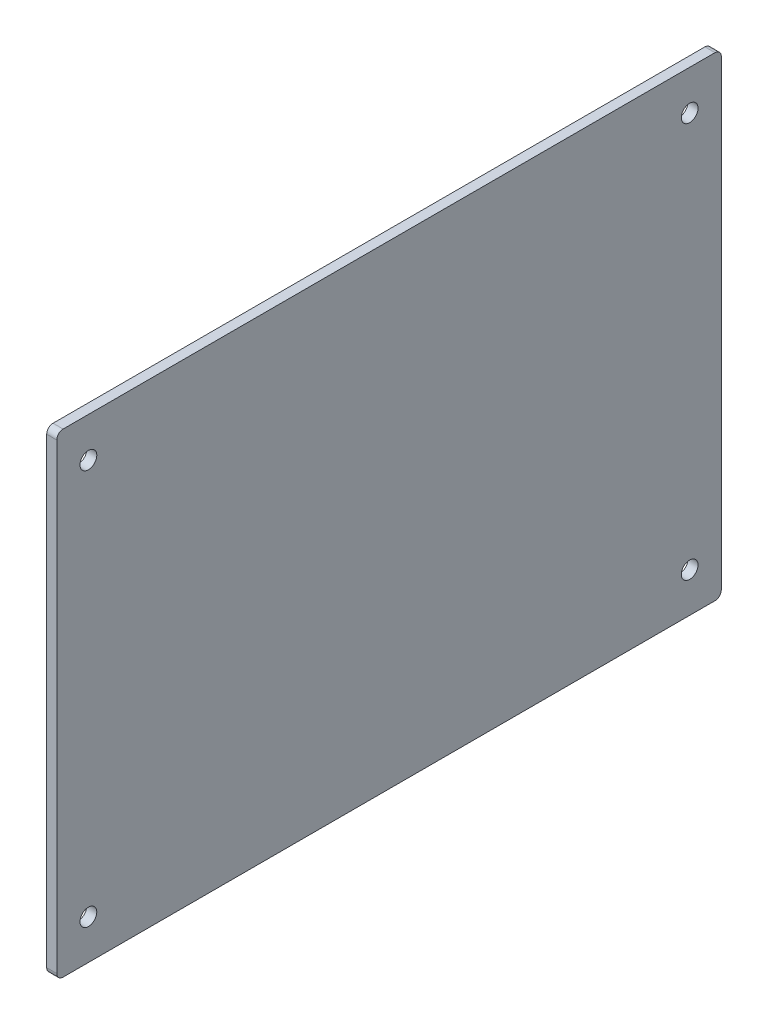
ISO-10303-21;
HEADER;
FILE_DESCRIPTION(('STEP AP214'),'2;1');
FILE_NAME('part.step','',(''),(''),'','','');
FILE_SCHEMA(('AUTOMOTIVE_DESIGN { 1 0 10303 214 1 1 1 1 }'));
ENDSEC;
DATA;
#1=APPLICATION_CONTEXT('core data for automotive mechanical design processes');
#2=APPLICATION_PROTOCOL_DEFINITION('international standard','automotive_design',2000,#1);
#3=PRODUCT_CONTEXT('',#1,'mechanical');
#4=PRODUCT('Part','Part','',(#3));
#5=PRODUCT_RELATED_PRODUCT_CATEGORY('part','',(#4));
#6=PRODUCT_DEFINITION_FORMATION('','',#4);
#7=PRODUCT_DEFINITION_CONTEXT('part definition',#1,'design');
#8=PRODUCT_DEFINITION('design','',#6,#7);
#9=PRODUCT_DEFINITION_SHAPE('','',#8);
#10=(LENGTH_UNIT() NAMED_UNIT(*) SI_UNIT(.MILLI.,.METRE.));
#11=(NAMED_UNIT(*) PLANE_ANGLE_UNIT() SI_UNIT($,.RADIAN.));
#12=(NAMED_UNIT(*) SI_UNIT($,.STERADIAN.) SOLID_ANGLE_UNIT());
#13=UNCERTAINTY_MEASURE_WITH_UNIT(LENGTH_MEASURE(1.E-05),#10,'distance_accuracy_value','');
#14=(GEOMETRIC_REPRESENTATION_CONTEXT(3) GLOBAL_UNCERTAINTY_ASSIGNED_CONTEXT((#13)) GLOBAL_UNIT_ASSIGNED_CONTEXT((#10,
#11,#12)) REPRESENTATION_CONTEXT('',''));
#15=CARTESIAN_POINT('',(0.,0.,0.));
#16=DIRECTION('',(0.,0.,1.));
#17=DIRECTION('',(1.,0.,0.));
#18=AXIS2_PLACEMENT_3D('',#15,#16,#17);
#19=CARTESIAN_POINT('',(0.,0.,0.));
#20=DIRECTION('',(-1.,0.,0.));
#21=DIRECTION('',(0.,0.,1.));
#22=AXIS2_PLACEMENT_3D('',#19,#20,#21);
#23=PLANE('',#22);
#24=DIRECTION('',(0.,1.,0.));
#25=VECTOR('',#24,1.);
#26=CARTESIAN_POINT('',(0.,-75.,-105.));
#27=LINE('',#26,#25);
#28=CARTESIAN_POINT('',(0.,-73.,-105.));
#29=VERTEX_POINT('',#28);
#30=CARTESIAN_POINT('',(0.,73.,-105.));
#31=VERTEX_POINT('',#30);
#32=EDGE_CURVE('E123',#29,#31,#27,.T.);
#33=ORIENTED_EDGE('',*,*,#32,.F.);
#34=CARTESIAN_POINT('',(0.,-73.,-103.));
#35=DIRECTION('',(-1.,0.,0.));
#36=DIRECTION('',(0.,0.,1.));
#37=AXIS2_PLACEMENT_3D('',#34,#35,#36);
#38=CIRCLE('',#37,2.);
#39=CARTESIAN_POINT('',(0.,-75.,-103.));
#40=VERTEX_POINT('',#39);
#41=EDGE_CURVE('E106',#29,#40,#38,.T.);
#42=ORIENTED_EDGE('',*,*,#41,.T.);
#43=DIRECTION('',(0.,0.,-1.));
#44=VECTOR('',#43,1.);
#45=CARTESIAN_POINT('',(0.,-75.,105.));
#46=LINE('',#45,#44);
#47=CARTESIAN_POINT('',(0.,-75.,103.));
#48=VERTEX_POINT('',#47);
#49=EDGE_CURVE('E147',#48,#40,#46,.T.);
#50=ORIENTED_EDGE('',*,*,#49,.F.);
#51=CARTESIAN_POINT('',(0.,-73.,103.));
#52=DIRECTION('',(-1.,0.,0.));
#53=DIRECTION('',(0.,0.,1.));
#54=AXIS2_PLACEMENT_3D('',#51,#52,#53);
#55=CIRCLE('',#54,2.);
#56=CARTESIAN_POINT('',(0.,-73.,105.));
#57=VERTEX_POINT('',#56);
#58=EDGE_CURVE('E117',#48,#57,#55,.T.);
#59=ORIENTED_EDGE('',*,*,#58,.T.);
#60=DIRECTION('',(0.,-1.,0.));
#61=VECTOR('',#60,1.);
#62=CARTESIAN_POINT('',(0.,-75.,105.));
#63=LINE('',#62,#61);
#64=CARTESIAN_POINT('',(0.,73.,105.));
#65=VERTEX_POINT('',#64);
#66=EDGE_CURVE('E137',#65,#57,#63,.T.);
#67=ORIENTED_EDGE('',*,*,#66,.F.);
#68=CARTESIAN_POINT('',(0.,73.,103.));
#69=DIRECTION('',(-1.,0.,0.));
#70=DIRECTION('',(0.,0.,1.));
#71=AXIS2_PLACEMENT_3D('',#68,#69,#70);
#72=CIRCLE('',#71,2.);
#73=CARTESIAN_POINT('',(0.,75.,103.));
#74=VERTEX_POINT('',#73);
#75=EDGE_CURVE('E127',#65,#74,#72,.T.);
#76=ORIENTED_EDGE('',*,*,#75,.T.);
#77=DIRECTION('',(0.,0.,1.));
#78=VECTOR('',#77,1.);
#79=CARTESIAN_POINT('',(0.,75.,105.));
#80=LINE('',#79,#78);
#81=CARTESIAN_POINT('',(0.,75.,-103.));
#82=VERTEX_POINT('',#81);
#83=EDGE_CURVE('E133',#82,#74,#80,.T.);
#84=ORIENTED_EDGE('',*,*,#83,.F.);
#85=CARTESIAN_POINT('',(0.,73.,-103.));
#86=DIRECTION('',(-1.,0.,0.));
#87=DIRECTION('',(0.,0.,1.));
#88=AXIS2_PLACEMENT_3D('',#85,#86,#87);
#89=CIRCLE('',#88,2.);
#90=EDGE_CURVE('E132',#82,#31,#89,.T.);
#91=ORIENTED_EDGE('',*,*,#90,.T.);
#92=EDGE_LOOP('',(#33,#42,#50,#59,#67,#76,#84,#91));
#93=FACE_BOUND('',#92,.T.);
#94=CARTESIAN_POINT('',(0.,-62.5,-95.));
#95=DIRECTION('',(1.,0.,0.));
#96=DIRECTION('',(0.,0.,-1.));
#97=AXIS2_PLACEMENT_3D('',#94,#95,#96);
#98=CIRCLE('',#97,2.65);
#99=CARTESIAN_POINT('',(0.,-62.5,-97.65));
#100=VERTEX_POINT('',#99);
#101=EDGE_CURVE('E134',#100,#100,#98,.T.);
#102=ORIENTED_EDGE('',*,*,#101,.T.);
#103=EDGE_LOOP('',(#102));
#104=FACE_BOUND('',#103,.T.);
#105=CARTESIAN_POINT('',(0.,-62.5,95.));
#106=DIRECTION('',(1.,0.,0.));
#107=DIRECTION('',(0.,0.,-1.));
#108=AXIS2_PLACEMENT_3D('',#105,#106,#107);
#109=CIRCLE('',#108,2.65);
#110=CARTESIAN_POINT('',(0.,-62.5,92.35));
#111=VERTEX_POINT('',#110);
#112=EDGE_CURVE('E192',#111,#111,#109,.T.);
#113=ORIENTED_EDGE('',*,*,#112,.T.);
#114=EDGE_LOOP('',(#113));
#115=FACE_BOUND('',#114,.T.);
#116=CARTESIAN_POINT('',(0.,62.5,-95.));
#117=DIRECTION('',(1.,0.,0.));
#118=DIRECTION('',(0.,0.,-1.));
#119=AXIS2_PLACEMENT_3D('',#116,#117,#118);
#120=CIRCLE('',#119,2.65);
#121=CARTESIAN_POINT('',(0.,62.5,-97.65));
#122=VERTEX_POINT('',#121);
#123=EDGE_CURVE('E198',#122,#122,#120,.T.);
#124=ORIENTED_EDGE('',*,*,#123,.T.);
#125=EDGE_LOOP('',(#124));
#126=FACE_BOUND('',#125,.T.);
#127=CARTESIAN_POINT('',(0.,62.5,95.));
#128=DIRECTION('',(1.,0.,0.));
#129=DIRECTION('',(0.,0.,-1.));
#130=AXIS2_PLACEMENT_3D('',#127,#128,#129);
#131=CIRCLE('',#130,2.65);
#132=CARTESIAN_POINT('',(0.,62.5,92.35));
#133=VERTEX_POINT('',#132);
#134=EDGE_CURVE('E204',#133,#133,#131,.T.);
#135=ORIENTED_EDGE('',*,*,#134,.T.);
#136=EDGE_LOOP('',(#135));
#137=FACE_BOUND('',#136,.T.);
#138=ADVANCED_FACE('F39',(#93,#104,#115,#126,#137),#23,.T.);
#139=CARTESIAN_POINT('',(3.175,-75.,-105.));
#140=DIRECTION('',(0.,0.,1.));
#141=DIRECTION('',(1.,0.,0.));
#142=AXIS2_PLACEMENT_3D('',#139,#140,#141);
#143=PLANE('',#142);
#144=DIRECTION('',(0.,1.,0.));
#145=VECTOR('',#144,1.);
#146=CARTESIAN_POINT('',(3.175,-75.,-105.));
#147=LINE('',#146,#145);
#148=CARTESIAN_POINT('',(3.175,-73.,-105.));
#149=VERTEX_POINT('',#148);
#150=CARTESIAN_POINT('',(3.175,73.,-105.));
#151=VERTEX_POINT('',#150);
#152=EDGE_CURVE('E126',#149,#151,#147,.T.);
#153=ORIENTED_EDGE('',*,*,#152,.F.);
#154=DIRECTION('',(-1.,0.,0.));
#155=VECTOR('',#154,1.);
#156=CARTESIAN_POINT('',(3.175,-73.,-105.));
#157=LINE('',#156,#155);
#158=EDGE_CURVE('E110',#149,#29,#157,.T.);
#159=ORIENTED_EDGE('',*,*,#158,.T.);
#160=ORIENTED_EDGE('',*,*,#32,.T.);
#161=DIRECTION('',(-1.,0.,0.));
#162=VECTOR('',#161,1.);
#163=CARTESIAN_POINT('',(3.175,73.,-105.));
#164=LINE('',#163,#162);
#165=EDGE_CURVE('E128',#31,#151,#164,.F.);
#166=ORIENTED_EDGE('',*,*,#165,.T.);
#167=EDGE_LOOP('',(#153,#159,#160,#166));
#168=FACE_BOUND('',#167,.T.);
#169=ADVANCED_FACE('F122',(#168),#143,.F.);
#170=CARTESIAN_POINT('',(3.175,75.,105.));
#171=DIRECTION('',(0.,-1.,0.));
#172=DIRECTION('',(0.,0.,-1.));
#173=AXIS2_PLACEMENT_3D('',#170,#171,#172);
#174=PLANE('',#173);
#175=DIRECTION('',(0.,0.,1.));
#176=VECTOR('',#175,1.);
#177=CARTESIAN_POINT('',(3.175,75.,105.));
#178=LINE('',#177,#176);
#179=CARTESIAN_POINT('',(3.175,75.,-103.));
#180=VERTEX_POINT('',#179);
#181=CARTESIAN_POINT('',(3.175,75.,103.));
#182=VERTEX_POINT('',#181);
#183=EDGE_CURVE('E170',#180,#182,#178,.T.);
#184=ORIENTED_EDGE('',*,*,#183,.F.);
#185=DIRECTION('',(-1.,0.,0.));
#186=VECTOR('',#185,1.);
#187=CARTESIAN_POINT('',(3.175,75.,-103.));
#188=LINE('',#187,#186);
#189=EDGE_CURVE('E11',#180,#82,#188,.T.);
#190=ORIENTED_EDGE('',*,*,#189,.T.);
#191=ORIENTED_EDGE('',*,*,#83,.T.);
#192=DIRECTION('',(-1.,0.,0.));
#193=VECTOR('',#192,1.);
#194=CARTESIAN_POINT('',(3.175,75.,103.));
#195=LINE('',#194,#193);
#196=EDGE_CURVE('E47',#74,#182,#195,.F.);
#197=ORIENTED_EDGE('',*,*,#196,.T.);
#198=EDGE_LOOP('',(#184,#190,#191,#197));
#199=FACE_BOUND('',#198,.T.);
#200=ADVANCED_FACE('F169',(#199),#174,.F.);
#201=CARTESIAN_POINT('',(3.175,-75.,105.));
#202=DIRECTION('',(0.,0.,-1.));
#203=DIRECTION('',(-1.,0.,0.));
#204=AXIS2_PLACEMENT_3D('',#201,#202,#203);
#205=PLANE('',#204);
#206=ORIENTED_EDGE('',*,*,#66,.T.);
#207=DIRECTION('',(-1.,0.,0.));
#208=VECTOR('',#207,1.);
#209=CARTESIAN_POINT('',(3.175,-73.,105.));
#210=LINE('',#209,#208);
#211=CARTESIAN_POINT('',(3.175,-73.,105.));
#212=VERTEX_POINT('',#211);
#213=EDGE_CURVE('E54',#57,#212,#210,.F.);
#214=ORIENTED_EDGE('',*,*,#213,.T.);
#215=DIRECTION('',(0.,-1.,0.));
#216=VECTOR('',#215,1.);
#217=CARTESIAN_POINT('',(3.175,-75.,105.));
#218=LINE('',#217,#216);
#219=CARTESIAN_POINT('',(3.175,73.,105.));
#220=VERTEX_POINT('',#219);
#221=EDGE_CURVE('E176',#220,#212,#218,.T.);
#222=ORIENTED_EDGE('',*,*,#221,.F.);
#223=DIRECTION('',(-1.,0.,0.));
#224=VECTOR('',#223,1.);
#225=CARTESIAN_POINT('',(3.175,73.,105.));
#226=LINE('',#225,#224);
#227=EDGE_CURVE('E163',#220,#65,#226,.T.);
#228=ORIENTED_EDGE('',*,*,#227,.T.);
#229=EDGE_LOOP('',(#206,#214,#222,#228));
#230=FACE_BOUND('',#229,.T.);
#231=ADVANCED_FACE('F180',(#230),#205,.F.);
#232=CARTESIAN_POINT('',(3.175,-75.,105.));
#233=DIRECTION('',(0.,1.,0.));
#234=DIRECTION('',(0.,0.,1.));
#235=AXIS2_PLACEMENT_3D('',#232,#233,#234);
#236=PLANE('',#235);
#237=ORIENTED_EDGE('',*,*,#49,.T.);
#238=DIRECTION('',(-1.,0.,0.));
#239=VECTOR('',#238,1.);
#240=CARTESIAN_POINT('',(3.175,-75.,-103.));
#241=LINE('',#240,#239);
#242=CARTESIAN_POINT('',(3.175,-75.,-103.));
#243=VERTEX_POINT('',#242);
#244=EDGE_CURVE('E111',#40,#243,#241,.F.);
#245=ORIENTED_EDGE('',*,*,#244,.T.);
#246=DIRECTION('',(0.,0.,-1.));
#247=VECTOR('',#246,1.);
#248=CARTESIAN_POINT('',(3.175,-75.,105.));
#249=LINE('',#248,#247);
#250=CARTESIAN_POINT('',(3.175,-75.,103.));
#251=VERTEX_POINT('',#250);
#252=EDGE_CURVE('E143',#251,#243,#249,.T.);
#253=ORIENTED_EDGE('',*,*,#252,.F.);
#254=DIRECTION('',(-1.,0.,0.));
#255=VECTOR('',#254,1.);
#256=CARTESIAN_POINT('',(3.175,-75.,103.));
#257=LINE('',#256,#255);
#258=EDGE_CURVE('E116',#251,#48,#257,.T.);
#259=ORIENTED_EDGE('',*,*,#258,.T.);
#260=EDGE_LOOP('',(#237,#245,#253,#259));
#261=FACE_BOUND('',#260,.T.);
#262=ADVANCED_FACE('F187',(#261),#236,.F.);
#263=CARTESIAN_POINT('',(3.175,0.,0.));
#264=DIRECTION('',(-1.,0.,0.));
#265=DIRECTION('',(0.,0.,1.));
#266=AXIS2_PLACEMENT_3D('',#263,#264,#265);
#267=PLANE('',#266);
#268=CARTESIAN_POINT('',(3.175,62.5,95.));
#269=DIRECTION('',(1.,0.,0.));
#270=DIRECTION('',(0.,0.,-1.));
#271=AXIS2_PLACEMENT_3D('',#268,#269,#270);
#272=CIRCLE('',#271,2.64999999999999);
#273=CARTESIAN_POINT('',(3.175,62.5,92.35));
#274=VERTEX_POINT('',#273);
#275=EDGE_CURVE('E207',#274,#274,#272,.T.);
#276=ORIENTED_EDGE('',*,*,#275,.F.);
#277=EDGE_LOOP('',(#276));
#278=FACE_BOUND('',#277,.T.);
#279=CARTESIAN_POINT('',(3.175,62.5,-95.));
#280=DIRECTION('',(1.,0.,0.));
#281=DIRECTION('',(0.,0.,-1.));
#282=AXIS2_PLACEMENT_3D('',#279,#280,#281);
#283=CIRCLE('',#282,2.64999999999999);
#284=CARTESIAN_POINT('',(3.175,62.5,-97.65));
#285=VERTEX_POINT('',#284);
#286=EDGE_CURVE('E201',#285,#285,#283,.T.);
#287=ORIENTED_EDGE('',*,*,#286,.F.);
#288=EDGE_LOOP('',(#287));
#289=FACE_BOUND('',#288,.T.);
#290=CARTESIAN_POINT('',(3.175,-62.5,95.));
#291=DIRECTION('',(1.,0.,0.));
#292=DIRECTION('',(0.,0.,-1.));
#293=AXIS2_PLACEMENT_3D('',#290,#291,#292);
#294=CIRCLE('',#293,2.64999999999999);
#295=CARTESIAN_POINT('',(3.175,-62.5,92.35));
#296=VERTEX_POINT('',#295);
#297=EDGE_CURVE('E195',#296,#296,#294,.T.);
#298=ORIENTED_EDGE('',*,*,#297,.F.);
#299=EDGE_LOOP('',(#298));
#300=FACE_BOUND('',#299,.T.);
#301=CARTESIAN_POINT('',(3.175,-62.5,-95.));
#302=DIRECTION('',(1.,0.,0.));
#303=DIRECTION('',(0.,0.,-1.));
#304=AXIS2_PLACEMENT_3D('',#301,#302,#303);
#305=CIRCLE('',#304,2.64999999999999);
#306=CARTESIAN_POINT('',(3.175,-62.5,-97.65));
#307=VERTEX_POINT('',#306);
#308=EDGE_CURVE('E140',#307,#307,#305,.T.);
#309=ORIENTED_EDGE('',*,*,#308,.F.);
#310=EDGE_LOOP('',(#309));
#311=FACE_BOUND('',#310,.T.);
#312=ORIENTED_EDGE('',*,*,#252,.T.);
#313=CARTESIAN_POINT('',(3.175,-73.,-103.));
#314=DIRECTION('',(-1.,0.,0.));
#315=DIRECTION('',(0.,0.,1.));
#316=AXIS2_PLACEMENT_3D('',#313,#314,#315);
#317=CIRCLE('',#316,2.);
#318=EDGE_CURVE('E161',#243,#149,#317,.F.);
#319=ORIENTED_EDGE('',*,*,#318,.T.);
#320=ORIENTED_EDGE('',*,*,#152,.T.);
#321=CARTESIAN_POINT('',(3.175,73.,-103.));
#322=DIRECTION('',(-1.,0.,0.));
#323=DIRECTION('',(0.,0.,1.));
#324=AXIS2_PLACEMENT_3D('',#321,#322,#323);
#325=CIRCLE('',#324,2.);
#326=EDGE_CURVE('E157',#151,#180,#325,.F.);
#327=ORIENTED_EDGE('',*,*,#326,.T.);
#328=ORIENTED_EDGE('',*,*,#183,.T.);
#329=CARTESIAN_POINT('',(3.175,73.,103.));
#330=DIRECTION('',(-1.,0.,0.));
#331=DIRECTION('',(0.,0.,1.));
#332=AXIS2_PLACEMENT_3D('',#329,#330,#331);
#333=CIRCLE('',#332,2.);
#334=EDGE_CURVE('E61',#182,#220,#333,.F.);
#335=ORIENTED_EDGE('',*,*,#334,.T.);
#336=ORIENTED_EDGE('',*,*,#221,.T.);
#337=CARTESIAN_POINT('',(3.175,-73.,103.));
#338=DIRECTION('',(-1.,0.,0.));
#339=DIRECTION('',(0.,0.,1.));
#340=AXIS2_PLACEMENT_3D('',#337,#338,#339);
#341=CIRCLE('',#340,2.);
#342=EDGE_CURVE('E159',#212,#251,#341,.F.);
#343=ORIENTED_EDGE('',*,*,#342,.T.);
#344=EDGE_LOOP('',(#312,#319,#320,#327,#328,#335,#336,#343));
#345=FACE_BOUND('',#344,.T.);
#346=ADVANCED_FACE('F174',(#278,#289,#300,#311,#345),#267,.F.);
#347=CARTESIAN_POINT('',(3.175,-62.5,-95.));
#348=DIRECTION('',(1.,0.,0.));
#349=DIRECTION('',(0.,0.,-1.));
#350=AXIS2_PLACEMENT_3D('',#347,#348,#349);
#351=CYLINDRICAL_SURFACE('',#350,2.64999999999999);
#352=ORIENTED_EDGE('',*,*,#101,.F.);
#353=EDGE_LOOP('',(#352));
#354=FACE_BOUND('',#353,.T.);
#355=ORIENTED_EDGE('',*,*,#308,.T.);
#356=EDGE_LOOP('',(#355));
#357=FACE_BOUND('',#356,.T.);
#358=ADVANCED_FACE('F215',(#354,#357),#351,.F.);
#359=CARTESIAN_POINT('',(3.175,-62.5,95.));
#360=DIRECTION('',(1.,0.,0.));
#361=DIRECTION('',(0.,0.,-1.));
#362=AXIS2_PLACEMENT_3D('',#359,#360,#361);
#363=CYLINDRICAL_SURFACE('',#362,2.64999999999999);
#364=ORIENTED_EDGE('',*,*,#112,.F.);
#365=EDGE_LOOP('',(#364));
#366=FACE_BOUND('',#365,.T.);
#367=ORIENTED_EDGE('',*,*,#297,.T.);
#368=EDGE_LOOP('',(#367));
#369=FACE_BOUND('',#368,.T.);
#370=ADVANCED_FACE('F224',(#366,#369),#363,.F.);
#371=CARTESIAN_POINT('',(3.175,62.5,-95.));
#372=DIRECTION('',(1.,0.,0.));
#373=DIRECTION('',(0.,0.,-1.));
#374=AXIS2_PLACEMENT_3D('',#371,#372,#373);
#375=CYLINDRICAL_SURFACE('',#374,2.64999999999999);
#376=ORIENTED_EDGE('',*,*,#123,.F.);
#377=EDGE_LOOP('',(#376));
#378=FACE_BOUND('',#377,.T.);
#379=ORIENTED_EDGE('',*,*,#286,.T.);
#380=EDGE_LOOP('',(#379));
#381=FACE_BOUND('',#380,.T.);
#382=ADVANCED_FACE('F230',(#378,#381),#375,.F.);
#383=CARTESIAN_POINT('',(3.175,62.5,95.));
#384=DIRECTION('',(1.,0.,0.));
#385=DIRECTION('',(0.,0.,-1.));
#386=AXIS2_PLACEMENT_3D('',#383,#384,#385);
#387=CYLINDRICAL_SURFACE('',#386,2.64999999999999);
#388=ORIENTED_EDGE('',*,*,#134,.F.);
#389=EDGE_LOOP('',(#388));
#390=FACE_BOUND('',#389,.T.);
#391=ORIENTED_EDGE('',*,*,#275,.T.);
#392=EDGE_LOOP('',(#391));
#393=FACE_BOUND('',#392,.T.);
#394=ADVANCED_FACE('F211',(#390,#393),#387,.F.);
#395=CARTESIAN_POINT('',(3.175,-73.,-103.));
#396=DIRECTION('',(-1.,0.,0.));
#397=DIRECTION('',(0.,0.,1.));
#398=AXIS2_PLACEMENT_3D('',#395,#396,#397);
#399=CYLINDRICAL_SURFACE('',#398,2.);
#400=ORIENTED_EDGE('',*,*,#318,.F.);
#401=ORIENTED_EDGE('',*,*,#244,.F.);
#402=ORIENTED_EDGE('',*,*,#41,.F.);
#403=ORIENTED_EDGE('',*,*,#158,.F.);
#404=EDGE_LOOP('',(#400,#401,#402,#403));
#405=FACE_BOUND('',#404,.T.);
#406=ADVANCED_FACE('F109',(#405),#399,.T.);
#407=CARTESIAN_POINT('',(3.175,-73.,103.));
#408=DIRECTION('',(-1.,0.,0.));
#409=DIRECTION('',(0.,0.,1.));
#410=AXIS2_PLACEMENT_3D('',#407,#408,#409);
#411=CYLINDRICAL_SURFACE('',#410,2.);
#412=ORIENTED_EDGE('',*,*,#342,.F.);
#413=ORIENTED_EDGE('',*,*,#213,.F.);
#414=ORIENTED_EDGE('',*,*,#58,.F.);
#415=ORIENTED_EDGE('',*,*,#258,.F.);
#416=EDGE_LOOP('',(#412,#413,#414,#415));
#417=FACE_BOUND('',#416,.T.);
#418=ADVANCED_FACE('F184',(#417),#411,.T.);
#419=CARTESIAN_POINT('',(3.175,73.,-103.));
#420=DIRECTION('',(-1.,0.,0.));
#421=DIRECTION('',(0.,0.,1.));
#422=AXIS2_PLACEMENT_3D('',#419,#420,#421);
#423=CYLINDRICAL_SURFACE('',#422,2.);
#424=ORIENTED_EDGE('',*,*,#326,.F.);
#425=ORIENTED_EDGE('',*,*,#165,.F.);
#426=ORIENTED_EDGE('',*,*,#90,.F.);
#427=ORIENTED_EDGE('',*,*,#189,.F.);
#428=EDGE_LOOP('',(#424,#425,#426,#427));
#429=FACE_BOUND('',#428,.T.);
#430=ADVANCED_FACE('F251',(#429),#423,.T.);
#431=CARTESIAN_POINT('',(3.175,73.,103.));
#432=DIRECTION('',(-1.,0.,0.));
#433=DIRECTION('',(0.,0.,1.));
#434=AXIS2_PLACEMENT_3D('',#431,#432,#433);
#435=CYLINDRICAL_SURFACE('',#434,2.);
#436=ORIENTED_EDGE('',*,*,#334,.F.);
#437=ORIENTED_EDGE('',*,*,#196,.F.);
#438=ORIENTED_EDGE('',*,*,#75,.F.);
#439=ORIENTED_EDGE('',*,*,#227,.F.);
#440=EDGE_LOOP('',(#436,#437,#438,#439));
#441=FACE_BOUND('',#440,.T.);
#442=ADVANCED_FACE('F41',(#441),#435,.T.);
#443=CLOSED_SHELL('',(#138,#169,#200,#231,#262,#346,#358,#370,#382,#394,#406,#418,#430,#442));
#444=MANIFOLD_SOLID_BREP('B2',#443);
#445=ADVANCED_BREP_SHAPE_REPRESENTATION('',(#18,#444),#14);
#446=SHAPE_DEFINITION_REPRESENTATION(#9,#445);
ENDSEC;
END-ISO-10303-21;
